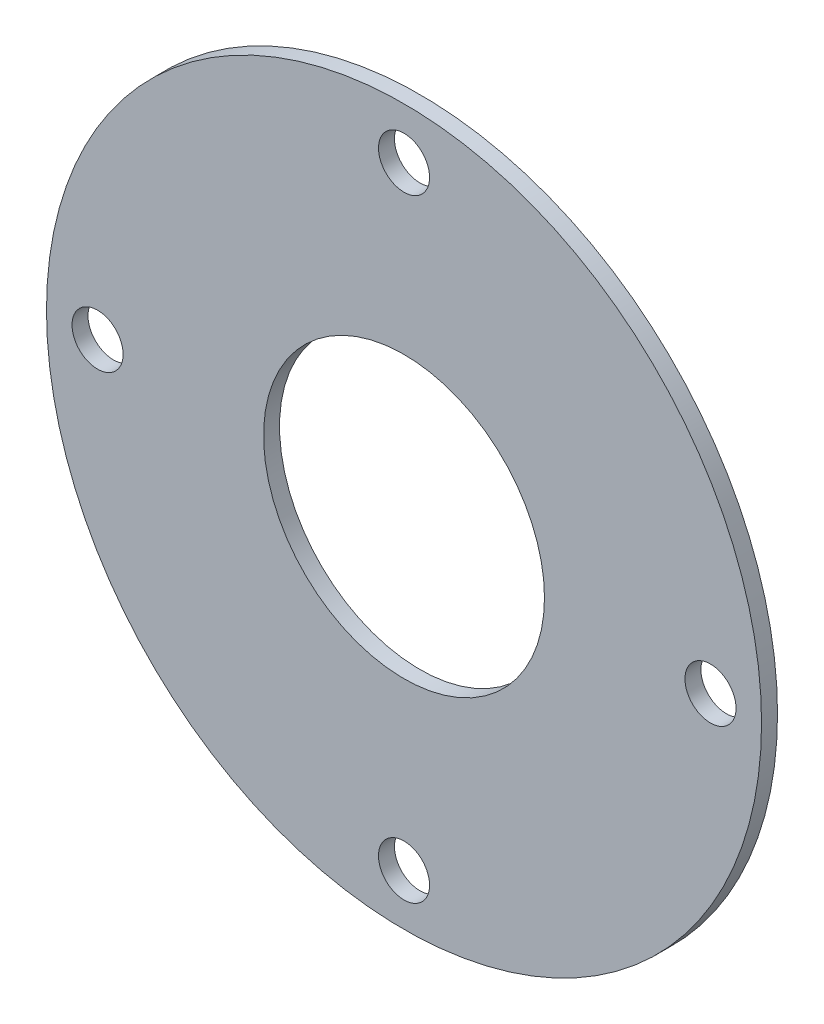
ISO-10303-21;
HEADER;
FILE_DESCRIPTION(('STEP AP214'),'2;1');
FILE_NAME('part.step','',(''),(''),'','','');
FILE_SCHEMA(('AUTOMOTIVE_DESIGN { 1 0 10303 214 1 1 1 1 }'));
ENDSEC;
DATA;
#1=APPLICATION_CONTEXT('core data for automotive mechanical design processes');
#2=APPLICATION_PROTOCOL_DEFINITION('international standard','automotive_design',2000,#1);
#3=PRODUCT_CONTEXT('',#1,'mechanical');
#4=PRODUCT('Part','Part','',(#3));
#5=PRODUCT_RELATED_PRODUCT_CATEGORY('part','',(#4));
#6=PRODUCT_DEFINITION_FORMATION('','',#4);
#7=PRODUCT_DEFINITION_CONTEXT('part definition',#1,'design');
#8=PRODUCT_DEFINITION('design','',#6,#7);
#9=PRODUCT_DEFINITION_SHAPE('','',#8);
#10=(LENGTH_UNIT() NAMED_UNIT(*) SI_UNIT(.MILLI.,.METRE.));
#11=(NAMED_UNIT(*) PLANE_ANGLE_UNIT() SI_UNIT($,.RADIAN.));
#12=(NAMED_UNIT(*) SI_UNIT($,.STERADIAN.) SOLID_ANGLE_UNIT());
#13=UNCERTAINTY_MEASURE_WITH_UNIT(LENGTH_MEASURE(1.E-05),#10,'distance_accuracy_value','');
#14=(GEOMETRIC_REPRESENTATION_CONTEXT(3) GLOBAL_UNCERTAINTY_ASSIGNED_CONTEXT((#13)) GLOBAL_UNIT_ASSIGNED_CONTEXT((#10,
#11,#12)) REPRESENTATION_CONTEXT('',''));
#15=CARTESIAN_POINT('',(0.,0.,0.));
#16=DIRECTION('',(0.,0.,1.));
#17=DIRECTION('',(1.,0.,0.));
#18=AXIS2_PLACEMENT_3D('',#15,#16,#17);
#19=CARTESIAN_POINT('',(0.,0.,34.5));
#20=DIRECTION('',(0.,0.,1.));
#21=DIRECTION('',(1.,0.,0.));
#22=AXIS2_PLACEMENT_3D('',#19,#20,#21);
#23=PLANE('',#22);
#24=CARTESIAN_POINT('',(48.,0.,34.5));
#25=DIRECTION('',(0.,0.,1.));
#26=DIRECTION('',(1.,0.,0.));
#27=AXIS2_PLACEMENT_3D('',#24,#25,#26);
#28=CIRCLE('',#27,4.);
#29=CARTESIAN_POINT('',(52.,0.,34.5));
#30=VERTEX_POINT('',#29);
#31=EDGE_CURVE('E84',#30,#30,#28,.T.);
#32=ORIENTED_EDGE('',*,*,#31,.F.);
#33=EDGE_LOOP('',(#32));
#34=FACE_BOUND('',#33,.T.);
#35=CARTESIAN_POINT('',(0.,48.,34.5));
#36=DIRECTION('',(0.,0.,1.));
#37=DIRECTION('',(1.,0.,0.));
#38=AXIS2_PLACEMENT_3D('',#35,#36,#37);
#39=CIRCLE('',#38,4.);
#40=CARTESIAN_POINT('',(4.,48.,34.5));
#41=VERTEX_POINT('',#40);
#42=EDGE_CURVE('E70',#41,#41,#39,.T.);
#43=ORIENTED_EDGE('',*,*,#42,.F.);
#44=EDGE_LOOP('',(#43));
#45=FACE_BOUND('',#44,.T.);
#46=CARTESIAN_POINT('',(-48.,0.,34.5));
#47=DIRECTION('',(0.,0.,1.));
#48=DIRECTION('',(1.,0.,0.));
#49=AXIS2_PLACEMENT_3D('',#46,#47,#48);
#50=CIRCLE('',#49,4.);
#51=CARTESIAN_POINT('',(-44.,0.,34.5));
#52=VERTEX_POINT('',#51);
#53=EDGE_CURVE('E66',#52,#52,#50,.T.);
#54=ORIENTED_EDGE('',*,*,#53,.F.);
#55=EDGE_LOOP('',(#54));
#56=FACE_BOUND('',#55,.T.);
#57=CARTESIAN_POINT('',(0.,-48.,34.5));
#58=DIRECTION('',(0.,0.,1.));
#59=DIRECTION('',(1.,0.,0.));
#60=AXIS2_PLACEMENT_3D('',#57,#58,#59);
#61=CIRCLE('',#60,4.);
#62=CARTESIAN_POINT('',(3.99999999999999,-48.,34.5));
#63=VERTEX_POINT('',#62);
#64=EDGE_CURVE('E62',#63,#63,#61,.T.);
#65=ORIENTED_EDGE('',*,*,#64,.F.);
#66=EDGE_LOOP('',(#65));
#67=FACE_BOUND('',#66,.T.);
#68=CARTESIAN_POINT('',(0.,0.,34.5));
#69=DIRECTION('',(0.,0.,1.));
#70=DIRECTION('',(1.,0.,0.));
#71=AXIS2_PLACEMENT_3D('',#68,#69,#70);
#72=CIRCLE('',#71,56.);
#73=CARTESIAN_POINT('',(56.,0.,34.5));
#74=VERTEX_POINT('',#73);
#75=EDGE_CURVE('E10',#74,#74,#72,.T.);
#76=ORIENTED_EDGE('',*,*,#75,.T.);
#77=EDGE_LOOP('',(#76));
#78=FACE_BOUND('',#77,.T.);
#79=CARTESIAN_POINT('',(0.,0.,34.5));
#80=DIRECTION('',(0.,0.,1.));
#81=DIRECTION('',(1.,0.,0.));
#82=AXIS2_PLACEMENT_3D('',#79,#80,#81);
#83=CIRCLE('',#82,22.);
#84=CARTESIAN_POINT('',(22.,0.,34.5));
#85=VERTEX_POINT('',#84);
#86=EDGE_CURVE('E52',#85,#85,#83,.T.);
#87=ORIENTED_EDGE('',*,*,#86,.F.);
#88=EDGE_LOOP('',(#87));
#89=FACE_BOUND('',#88,.T.);
#90=ADVANCED_FACE('F36',(#34,#45,#56,#67,#78,#89),#23,.T.);
#91=CARTESIAN_POINT('',(0.,0.,32.));
#92=DIRECTION('',(0.,0.,1.));
#93=DIRECTION('',(1.,0.,0.));
#94=AXIS2_PLACEMENT_3D('',#91,#92,#93);
#95=PLANE('',#94);
#96=CARTESIAN_POINT('',(48.,0.,32.));
#97=DIRECTION('',(0.,0.,1.));
#98=DIRECTION('',(1.,0.,0.));
#99=AXIS2_PLACEMENT_3D('',#96,#97,#98);
#100=CIRCLE('',#99,4.);
#101=CARTESIAN_POINT('',(52.,0.,32.));
#102=VERTEX_POINT('',#101);
#103=EDGE_CURVE('E40',#102,#102,#100,.T.);
#104=ORIENTED_EDGE('',*,*,#103,.T.);
#105=EDGE_LOOP('',(#104));
#106=FACE_BOUND('',#105,.T.);
#107=CARTESIAN_POINT('',(0.,48.,32.));
#108=DIRECTION('',(0.,0.,1.));
#109=DIRECTION('',(1.,0.,0.));
#110=AXIS2_PLACEMENT_3D('',#107,#108,#109);
#111=CIRCLE('',#110,4.);
#112=CARTESIAN_POINT('',(4.,48.,32.));
#113=VERTEX_POINT('',#112);
#114=EDGE_CURVE('E67',#113,#113,#111,.T.);
#115=ORIENTED_EDGE('',*,*,#114,.T.);
#116=EDGE_LOOP('',(#115));
#117=FACE_BOUND('',#116,.T.);
#118=CARTESIAN_POINT('',(-48.,0.,32.));
#119=DIRECTION('',(0.,0.,1.));
#120=DIRECTION('',(1.,0.,0.));
#121=AXIS2_PLACEMENT_3D('',#118,#119,#120);
#122=CIRCLE('',#121,4.);
#123=CARTESIAN_POINT('',(-44.,0.,32.));
#124=VERTEX_POINT('',#123);
#125=EDGE_CURVE('E63',#124,#124,#122,.T.);
#126=ORIENTED_EDGE('',*,*,#125,.T.);
#127=EDGE_LOOP('',(#126));
#128=FACE_BOUND('',#127,.T.);
#129=CARTESIAN_POINT('',(0.,-48.,32.));
#130=DIRECTION('',(0.,0.,1.));
#131=DIRECTION('',(1.,0.,0.));
#132=AXIS2_PLACEMENT_3D('',#129,#130,#131);
#133=CIRCLE('',#132,4.);
#134=CARTESIAN_POINT('',(3.99999999999999,-48.,32.));
#135=VERTEX_POINT('',#134);
#136=EDGE_CURVE('E58',#135,#135,#133,.T.);
#137=ORIENTED_EDGE('',*,*,#136,.T.);
#138=EDGE_LOOP('',(#137));
#139=FACE_BOUND('',#138,.T.);
#140=CARTESIAN_POINT('',(0.,0.,32.));
#141=DIRECTION('',(0.,0.,1.));
#142=DIRECTION('',(1.,0.,0.));
#143=AXIS2_PLACEMENT_3D('',#140,#141,#142);
#144=CIRCLE('',#143,56.);
#145=CARTESIAN_POINT('',(56.,0.,32.));
#146=VERTEX_POINT('',#145);
#147=EDGE_CURVE('E45',#146,#146,#144,.T.);
#148=ORIENTED_EDGE('',*,*,#147,.F.);
#149=EDGE_LOOP('',(#148));
#150=FACE_BOUND('',#149,.T.);
#151=CARTESIAN_POINT('',(0.,0.,32.));
#152=DIRECTION('',(0.,0.,1.));
#153=DIRECTION('',(1.,0.,0.));
#154=AXIS2_PLACEMENT_3D('',#151,#152,#153);
#155=CIRCLE('',#154,22.);
#156=CARTESIAN_POINT('',(22.,0.,32.));
#157=VERTEX_POINT('',#156);
#158=EDGE_CURVE('E55',#157,#157,#155,.T.);
#159=ORIENTED_EDGE('',*,*,#158,.T.);
#160=EDGE_LOOP('',(#159));
#161=FACE_BOUND('',#160,.T.);
#162=ADVANCED_FACE('F95',(#106,#117,#128,#139,#150,#161),#95,.F.);
#163=CARTESIAN_POINT('',(0.,0.,34.5));
#164=DIRECTION('',(0.,0.,-1.));
#165=DIRECTION('',(-1.,0.,0.));
#166=AXIS2_PLACEMENT_3D('',#163,#164,#165);
#167=CYLINDRICAL_SURFACE('',#166,56.);
#168=ORIENTED_EDGE('',*,*,#75,.F.);
#169=EDGE_LOOP('',(#168));
#170=FACE_BOUND('',#169,.T.);
#171=ORIENTED_EDGE('',*,*,#147,.T.);
#172=EDGE_LOOP('',(#171));
#173=FACE_BOUND('',#172,.T.);
#174=ADVANCED_FACE('F38',(#170,#173),#167,.T.);
#175=CARTESIAN_POINT('',(0.,0.,34.5));
#176=DIRECTION('',(0.,0.,-1.));
#177=DIRECTION('',(-1.,0.,0.));
#178=AXIS2_PLACEMENT_3D('',#175,#176,#177);
#179=CYLINDRICAL_SURFACE('',#178,22.);
#180=ORIENTED_EDGE('',*,*,#86,.T.);
#181=EDGE_LOOP('',(#180));
#182=FACE_BOUND('',#181,.T.);
#183=ORIENTED_EDGE('',*,*,#158,.F.);
#184=EDGE_LOOP('',(#183));
#185=FACE_BOUND('',#184,.T.);
#186=ADVANCED_FACE('F97',(#182,#185),#179,.F.);
#187=CARTESIAN_POINT('',(0.,-48.,-100.));
#188=DIRECTION('',(0.,0.,1.));
#189=DIRECTION('',(1.,0.,0.));
#190=AXIS2_PLACEMENT_3D('',#187,#188,#189);
#191=CYLINDRICAL_SURFACE('',#190,4.);
#192=ORIENTED_EDGE('',*,*,#64,.T.);
#193=EDGE_LOOP('',(#192));
#194=FACE_BOUND('',#193,.T.);
#195=ORIENTED_EDGE('',*,*,#136,.F.);
#196=EDGE_LOOP('',(#195));
#197=FACE_BOUND('',#196,.T.);
#198=ADVANCED_FACE('F99',(#194,#197),#191,.F.);
#199=CARTESIAN_POINT('',(-48.,0.,-100.));
#200=DIRECTION('',(0.,0.,1.));
#201=DIRECTION('',(1.,0.,0.));
#202=AXIS2_PLACEMENT_3D('',#199,#200,#201);
#203=CYLINDRICAL_SURFACE('',#202,4.);
#204=ORIENTED_EDGE('',*,*,#53,.T.);
#205=EDGE_LOOP('',(#204));
#206=FACE_BOUND('',#205,.T.);
#207=ORIENTED_EDGE('',*,*,#125,.F.);
#208=EDGE_LOOP('',(#207));
#209=FACE_BOUND('',#208,.T.);
#210=ADVANCED_FACE('F105',(#206,#209),#203,.F.);
#211=CARTESIAN_POINT('',(0.,48.,-100.));
#212=DIRECTION('',(0.,0.,1.));
#213=DIRECTION('',(1.,0.,0.));
#214=AXIS2_PLACEMENT_3D('',#211,#212,#213);
#215=CYLINDRICAL_SURFACE('',#214,4.);
#216=ORIENTED_EDGE('',*,*,#42,.T.);
#217=EDGE_LOOP('',(#216));
#218=FACE_BOUND('',#217,.T.);
#219=ORIENTED_EDGE('',*,*,#114,.F.);
#220=EDGE_LOOP('',(#219));
#221=FACE_BOUND('',#220,.T.);
#222=ADVANCED_FACE('F131',(#218,#221),#215,.F.);
#223=CARTESIAN_POINT('',(48.,0.,-100.));
#224=DIRECTION('',(0.,0.,1.));
#225=DIRECTION('',(1.,0.,0.));
#226=AXIS2_PLACEMENT_3D('',#223,#224,#225);
#227=CYLINDRICAL_SURFACE('',#226,4.);
#228=ORIENTED_EDGE('',*,*,#31,.T.);
#229=EDGE_LOOP('',(#228));
#230=FACE_BOUND('',#229,.T.);
#231=ORIENTED_EDGE('',*,*,#103,.F.);
#232=EDGE_LOOP('',(#231));
#233=FACE_BOUND('',#232,.T.);
#234=ADVANCED_FACE('F134',(#230,#233),#227,.F.);
#235=CLOSED_SHELL('',(#90,#162,#174,#186,#198,#210,#222,#234));
#236=MANIFOLD_SOLID_BREP('B2',#235);
#237=ADVANCED_BREP_SHAPE_REPRESENTATION('',(#18,#236),#14);
#238=SHAPE_DEFINITION_REPRESENTATION(#9,#237);
ENDSEC;
END-ISO-10303-21;
